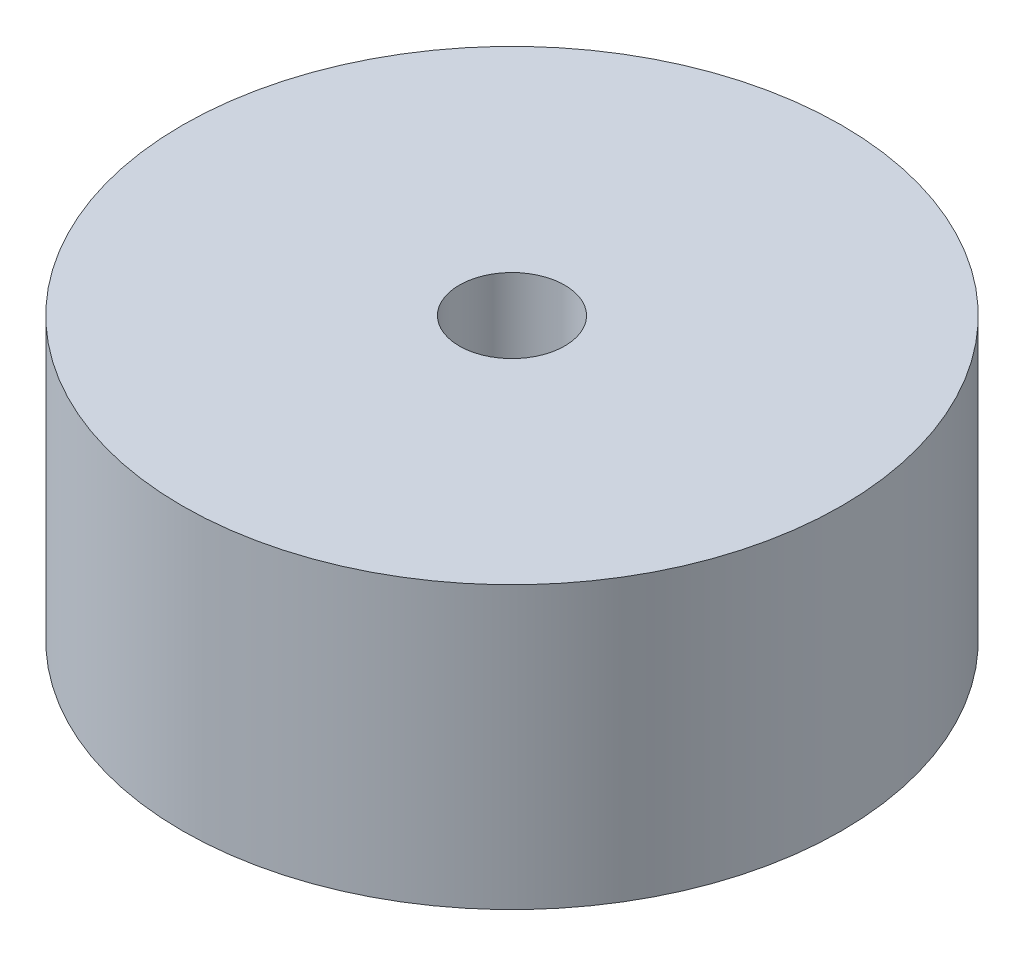
ISO-10303-21;
HEADER;
FILE_DESCRIPTION(('STEP AP214'),'2;1');
FILE_NAME('part.step','',(''),(''),'','','');
FILE_SCHEMA(('AUTOMOTIVE_DESIGN { 1 0 10303 214 1 1 1 1 }'));
ENDSEC;
DATA;
#1=APPLICATION_CONTEXT('core data for automotive mechanical design processes');
#2=APPLICATION_PROTOCOL_DEFINITION('international standard','automotive_design',2000,#1);
#3=PRODUCT_CONTEXT('',#1,'mechanical');
#4=PRODUCT('Part','Part','',(#3));
#5=PRODUCT_RELATED_PRODUCT_CATEGORY('part','',(#4));
#6=PRODUCT_DEFINITION_FORMATION('','',#4);
#7=PRODUCT_DEFINITION_CONTEXT('part definition',#1,'design');
#8=PRODUCT_DEFINITION('design','',#6,#7);
#9=PRODUCT_DEFINITION_SHAPE('','',#8);
#10=(LENGTH_UNIT() NAMED_UNIT(*) SI_UNIT(.MILLI.,.METRE.));
#11=(NAMED_UNIT(*) PLANE_ANGLE_UNIT() SI_UNIT($,.RADIAN.));
#12=(NAMED_UNIT(*) SI_UNIT($,.STERADIAN.) SOLID_ANGLE_UNIT());
#13=UNCERTAINTY_MEASURE_WITH_UNIT(LENGTH_MEASURE(1.E-05),#10,'distance_accuracy_value','');
#14=(GEOMETRIC_REPRESENTATION_CONTEXT(3) GLOBAL_UNCERTAINTY_ASSIGNED_CONTEXT((#13)) GLOBAL_UNIT_ASSIGNED_CONTEXT((#10,
#11,#12)) REPRESENTATION_CONTEXT('',''));
#15=CARTESIAN_POINT('',(0.,0.,0.));
#16=DIRECTION('',(0.,0.,1.));
#17=DIRECTION('',(1.,0.,0.));
#18=AXIS2_PLACEMENT_3D('',#15,#16,#17);
#19=CARTESIAN_POINT('',(0.,32.,0.));
#20=DIRECTION('',(0.,1.,0.));
#21=DIRECTION('',(0.,0.,1.));
#22=AXIS2_PLACEMENT_3D('',#19,#20,#21);
#23=PLANE('',#22);
#24=CARTESIAN_POINT('',(0.,32.,0.));
#25=DIRECTION('',(0.,1.,0.));
#26=DIRECTION('',(0.,0.,1.));
#27=AXIS2_PLACEMENT_3D('',#24,#25,#26);
#28=CIRCLE('',#27,37.5);
#29=CARTESIAN_POINT('',(0.,32.,37.5));
#30=VERTEX_POINT('',#29);
#31=EDGE_CURVE('E10',#30,#30,#28,.T.);
#32=ORIENTED_EDGE('',*,*,#31,.T.);
#33=EDGE_LOOP('',(#32));
#34=FACE_BOUND('',#33,.T.);
#35=CARTESIAN_POINT('',(0.,32.,0.));
#36=DIRECTION('',(0.,1.,0.));
#37=DIRECTION('',(0.,0.,1.));
#38=AXIS2_PLACEMENT_3D('',#35,#36,#37);
#39=CIRCLE('',#38,6.);
#40=CARTESIAN_POINT('',(0.,32.,6.));
#41=VERTEX_POINT('',#40);
#42=EDGE_CURVE('E50',#41,#41,#39,.T.);
#43=ORIENTED_EDGE('',*,*,#42,.F.);
#44=EDGE_LOOP('',(#43));
#45=FACE_BOUND('',#44,.T.);
#46=ADVANCED_FACE('F39',(#34,#45),#23,.T.);
#47=CARTESIAN_POINT('',(0.,0.,0.));
#48=DIRECTION('',(0.,1.,0.));
#49=DIRECTION('',(0.,0.,1.));
#50=AXIS2_PLACEMENT_3D('',#47,#48,#49);
#51=PLANE('',#50);
#52=CARTESIAN_POINT('',(0.,0.,0.));
#53=DIRECTION('',(0.,1.,0.));
#54=DIRECTION('',(0.,0.,1.));
#55=AXIS2_PLACEMENT_3D('',#52,#53,#54);
#56=CIRCLE('',#55,37.5);
#57=CARTESIAN_POINT('',(0.,0.,37.5));
#58=VERTEX_POINT('',#57);
#59=EDGE_CURVE('E43',#58,#58,#56,.T.);
#60=ORIENTED_EDGE('',*,*,#59,.F.);
#61=EDGE_LOOP('',(#60));
#62=FACE_BOUND('',#61,.T.);
#63=CARTESIAN_POINT('',(0.,0.,0.));
#64=DIRECTION('',(0.,1.,0.));
#65=DIRECTION('',(0.,0.,1.));
#66=AXIS2_PLACEMENT_3D('',#63,#64,#65);
#67=CIRCLE('',#66,6.);
#68=CARTESIAN_POINT('',(0.,0.,6.));
#69=VERTEX_POINT('',#68);
#70=EDGE_CURVE('E52',#69,#69,#67,.T.);
#71=ORIENTED_EDGE('',*,*,#70,.T.);
#72=EDGE_LOOP('',(#71));
#73=FACE_BOUND('',#72,.T.);
#74=ADVANCED_FACE('F62',(#62,#73),#51,.F.);
#75=CARTESIAN_POINT('',(0.,32.,0.));
#76=DIRECTION('',(0.,-1.,0.));
#77=DIRECTION('',(0.,0.,-1.));
#78=AXIS2_PLACEMENT_3D('',#75,#76,#77);
#79=CYLINDRICAL_SURFACE('',#78,37.5);
#80=ORIENTED_EDGE('',*,*,#31,.F.);
#81=EDGE_LOOP('',(#80));
#82=FACE_BOUND('',#81,.T.);
#83=ORIENTED_EDGE('',*,*,#59,.T.);
#84=EDGE_LOOP('',(#83));
#85=FACE_BOUND('',#84,.T.);
#86=ADVANCED_FACE('F41',(#82,#85),#79,.T.);
#87=CARTESIAN_POINT('',(0.,32.,0.));
#88=DIRECTION('',(0.,-1.,0.));
#89=DIRECTION('',(0.,0.,-1.));
#90=AXIS2_PLACEMENT_3D('',#87,#88,#89);
#91=CYLINDRICAL_SURFACE('',#90,6.);
#92=ORIENTED_EDGE('',*,*,#42,.T.);
#93=EDGE_LOOP('',(#92));
#94=FACE_BOUND('',#93,.T.);
#95=ORIENTED_EDGE('',*,*,#70,.F.);
#96=EDGE_LOOP('',(#95));
#97=FACE_BOUND('',#96,.T.);
#98=ADVANCED_FACE('F58',(#94,#97),#91,.F.);
#99=CLOSED_SHELL('',(#46,#74,#86,#98));
#100=MANIFOLD_SOLID_BREP('B2',#99);
#101=ADVANCED_BREP_SHAPE_REPRESENTATION('',(#18,#100),#14);
#102=SHAPE_DEFINITION_REPRESENTATION(#9,#101);
ENDSEC;
END-ISO-10303-21;
